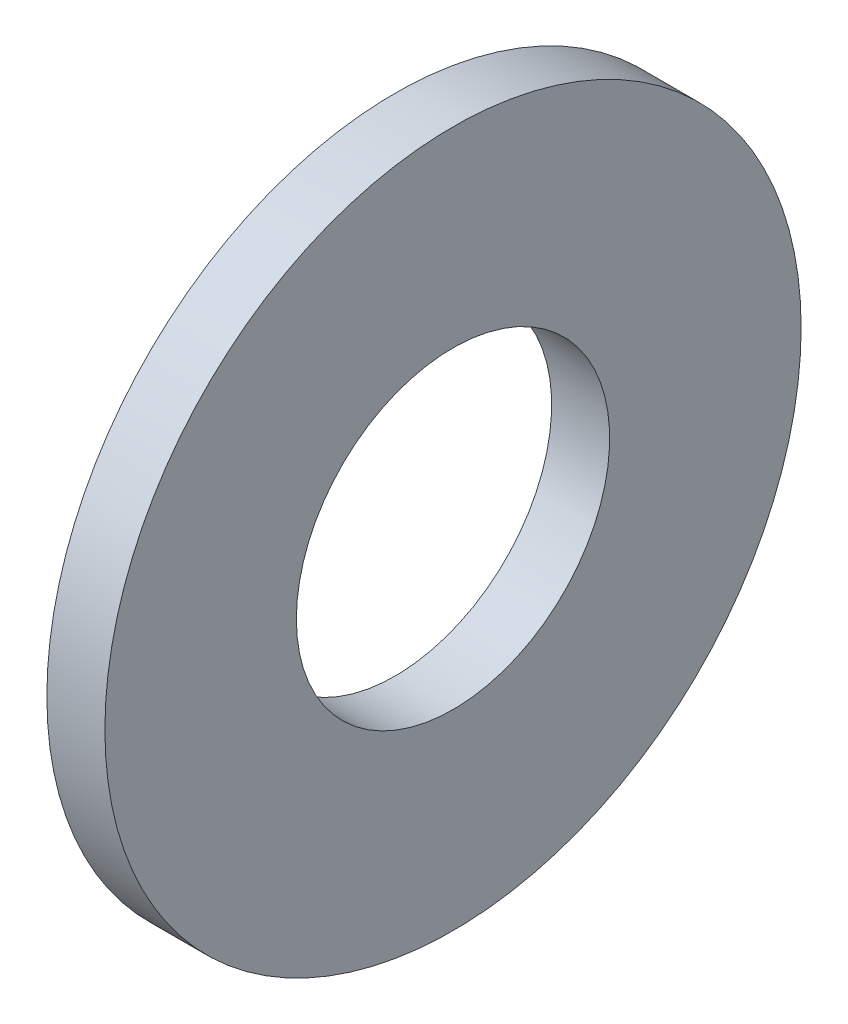
ISO-10303-21;
HEADER;
FILE_DESCRIPTION(('STEP AP214'),'2;1');
FILE_NAME('part.step','',(''),(''),'','','');
FILE_SCHEMA(('AUTOMOTIVE_DESIGN { 1 0 10303 214 1 1 1 1 }'));
ENDSEC;
DATA;
#1=APPLICATION_CONTEXT('core data for automotive mechanical design processes');
#2=APPLICATION_PROTOCOL_DEFINITION('international standard','automotive_design',2000,#1);
#3=PRODUCT_CONTEXT('',#1,'mechanical');
#4=PRODUCT('Part','Part','',(#3));
#5=PRODUCT_RELATED_PRODUCT_CATEGORY('part','',(#4));
#6=PRODUCT_DEFINITION_FORMATION('','',#4);
#7=PRODUCT_DEFINITION_CONTEXT('part definition',#1,'design');
#8=PRODUCT_DEFINITION('design','',#6,#7);
#9=PRODUCT_DEFINITION_SHAPE('','',#8);
#10=(LENGTH_UNIT() NAMED_UNIT(*) SI_UNIT(.MILLI.,.METRE.));
#11=(NAMED_UNIT(*) PLANE_ANGLE_UNIT() SI_UNIT($,.RADIAN.));
#12=(NAMED_UNIT(*) SI_UNIT($,.STERADIAN.) SOLID_ANGLE_UNIT());
#13=UNCERTAINTY_MEASURE_WITH_UNIT(LENGTH_MEASURE(1.E-05),#10,'distance_accuracy_value','');
#14=(GEOMETRIC_REPRESENTATION_CONTEXT(3) GLOBAL_UNCERTAINTY_ASSIGNED_CONTEXT((#13)) GLOBAL_UNIT_ASSIGNED_CONTEXT((#10,
#11,#12)) REPRESENTATION_CONTEXT('',''));
#15=CARTESIAN_POINT('',(0.,0.,0.));
#16=DIRECTION('',(0.,0.,1.));
#17=DIRECTION('',(1.,0.,0.));
#18=AXIS2_PLACEMENT_3D('',#15,#16,#17);
#19=CARTESIAN_POINT('',(-34.9249999999999,0.,0.));
#20=DIRECTION('',(-1.,0.,0.));
#21=DIRECTION('',(0.,0.,1.));
#22=AXIS2_PLACEMENT_3D('',#19,#20,#21);
#23=CYLINDRICAL_SURFACE('',#22,1.35);
#24=CARTESIAN_POINT('',(0.,0.,0.));
#25=DIRECTION('',(-1.,0.,0.));
#26=DIRECTION('',(0.,0.,1.));
#27=AXIS2_PLACEMENT_3D('',#24,#25,#26);
#28=CIRCLE('',#27,1.35);
#29=CARTESIAN_POINT('',(0.,0.,1.35));
#30=VERTEX_POINT('',#29);
#31=EDGE_CURVE('E10',#30,#30,#28,.T.);
#32=ORIENTED_EDGE('',*,*,#31,.F.);
#33=EDGE_LOOP('',(#32));
#34=FACE_BOUND('',#33,.T.);
#35=CARTESIAN_POINT('',(-0.5,0.,0.));
#36=DIRECTION('',(-1.,0.,0.));
#37=DIRECTION('',(0.,0.,1.));
#38=AXIS2_PLACEMENT_3D('',#35,#36,#37);
#39=CIRCLE('',#38,1.35);
#40=CARTESIAN_POINT('',(-0.5,0.,1.35));
#41=VERTEX_POINT('',#40);
#42=EDGE_CURVE('E45',#41,#41,#39,.T.);
#43=ORIENTED_EDGE('',*,*,#42,.T.);
#44=EDGE_LOOP('',(#43));
#45=FACE_BOUND('',#44,.T.);
#46=ADVANCED_FACE('F31',(#34,#45),#23,.F.);
#47=CARTESIAN_POINT('',(0.,1.35,0.));
#48=DIRECTION('',(-1.,0.,0.));
#49=DIRECTION('',(0.,0.,1.));
#50=AXIS2_PLACEMENT_3D('',#47,#48,#49);
#51=PLANE('',#50);
#52=CARTESIAN_POINT('',(0.,0.,0.));
#53=DIRECTION('',(-1.,0.,0.));
#54=DIRECTION('',(0.,0.,1.));
#55=AXIS2_PLACEMENT_3D('',#52,#53,#54);
#56=CIRCLE('',#55,3.);
#57=CARTESIAN_POINT('',(0.,0.,3.));
#58=VERTEX_POINT('',#57);
#59=EDGE_CURVE('E37',#58,#58,#56,.T.);
#60=ORIENTED_EDGE('',*,*,#59,.F.);
#61=EDGE_LOOP('',(#60));
#62=FACE_BOUND('',#61,.T.);
#63=ORIENTED_EDGE('',*,*,#31,.T.);
#64=EDGE_LOOP('',(#63));
#65=FACE_BOUND('',#64,.T.);
#66=ADVANCED_FACE('F60',(#62,#65),#51,.F.);
#67=CARTESIAN_POINT('',(-34.9249999999999,0.,0.));
#68=DIRECTION('',(-1.,0.,0.));
#69=DIRECTION('',(0.,0.,1.));
#70=AXIS2_PLACEMENT_3D('',#67,#68,#69);
#71=CYLINDRICAL_SURFACE('',#70,3.);
#72=CARTESIAN_POINT('',(-0.5,0.,0.));
#73=DIRECTION('',(-1.,0.,0.));
#74=DIRECTION('',(0.,0.,1.));
#75=AXIS2_PLACEMENT_3D('',#72,#73,#74);
#76=CIRCLE('',#75,3.);
#77=CARTESIAN_POINT('',(-0.5,0.,3.));
#78=VERTEX_POINT('',#77);
#79=EDGE_CURVE('E41',#78,#78,#76,.T.);
#80=ORIENTED_EDGE('',*,*,#79,.F.);
#81=EDGE_LOOP('',(#80));
#82=FACE_BOUND('',#81,.T.);
#83=ORIENTED_EDGE('',*,*,#59,.T.);
#84=EDGE_LOOP('',(#83));
#85=FACE_BOUND('',#84,.T.);
#86=ADVANCED_FACE('F55',(#82,#85),#71,.T.);
#87=CARTESIAN_POINT('',(-0.5,3.,0.));
#88=DIRECTION('',(1.,0.,0.));
#89=DIRECTION('',(0.,0.,-1.));
#90=AXIS2_PLACEMENT_3D('',#87,#88,#89);
#91=PLANE('',#90);
#92=ORIENTED_EDGE('',*,*,#42,.F.);
#93=EDGE_LOOP('',(#92));
#94=FACE_BOUND('',#93,.T.);
#95=ORIENTED_EDGE('',*,*,#79,.T.);
#96=EDGE_LOOP('',(#95));
#97=FACE_BOUND('',#96,.T.);
#98=ADVANCED_FACE('F52',(#94,#97),#91,.F.);
#99=CLOSED_SHELL('',(#46,#66,#86,#98));
#100=MANIFOLD_SOLID_BREP('B2',#99);
#101=ADVANCED_BREP_SHAPE_REPRESENTATION('',(#18,#100),#14);
#102=SHAPE_DEFINITION_REPRESENTATION(#9,#101);
ENDSEC;
END-ISO-10303-21;
